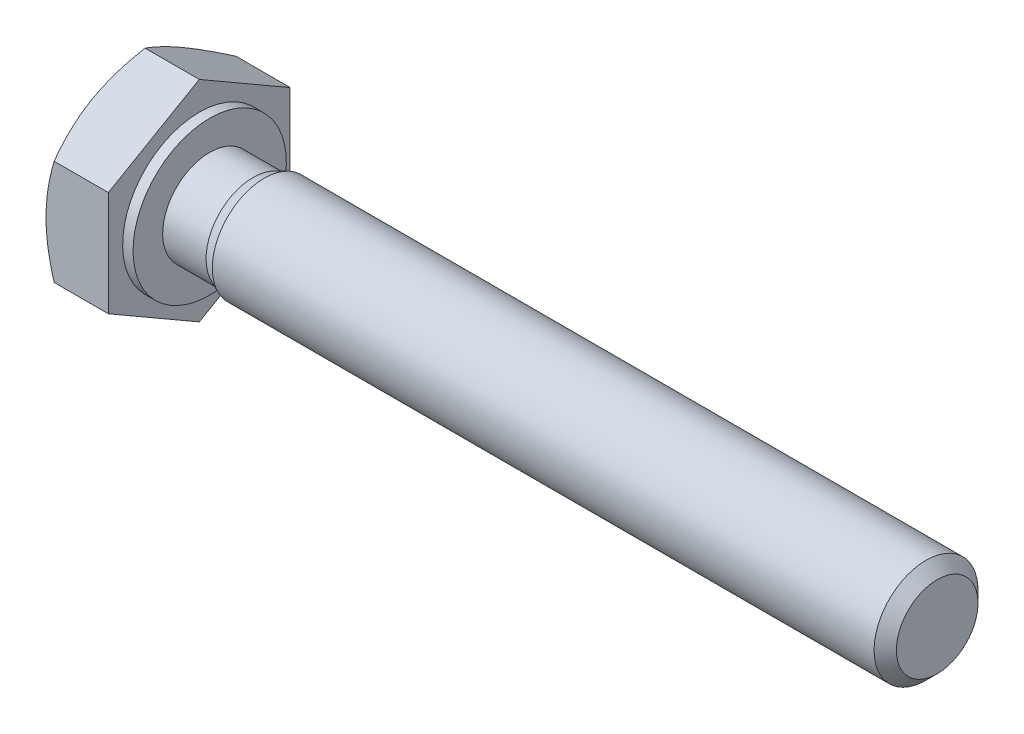
ISO-10303-21;
HEADER;
FILE_DESCRIPTION(('STEP AP214'),'2;1');
FILE_NAME('part.step','',(''),(''),'','','');
FILE_SCHEMA(('AUTOMOTIVE_DESIGN { 1 0 10303 214 1 1 1 1 }'));
ENDSEC;
DATA;
#1=APPLICATION_CONTEXT('core data for automotive mechanical design processes');
#2=APPLICATION_PROTOCOL_DEFINITION('international standard','automotive_design',2000,#1);
#3=PRODUCT_CONTEXT('',#1,'mechanical');
#4=PRODUCT('Part','Part','',(#3));
#5=PRODUCT_RELATED_PRODUCT_CATEGORY('part','',(#4));
#6=PRODUCT_DEFINITION_FORMATION('','',#4);
#7=PRODUCT_DEFINITION_CONTEXT('part definition',#1,'design');
#8=PRODUCT_DEFINITION('design','',#6,#7);
#9=PRODUCT_DEFINITION_SHAPE('','',#8);
#10=(LENGTH_UNIT() NAMED_UNIT(*) SI_UNIT(.MILLI.,.METRE.));
#11=(NAMED_UNIT(*) PLANE_ANGLE_UNIT() SI_UNIT($,.RADIAN.));
#12=(NAMED_UNIT(*) SI_UNIT($,.STERADIAN.) SOLID_ANGLE_UNIT());
#13=UNCERTAINTY_MEASURE_WITH_UNIT(LENGTH_MEASURE(1.E-05),#10,'distance_accuracy_value','');
#14=(GEOMETRIC_REPRESENTATION_CONTEXT(3) GLOBAL_UNCERTAINTY_ASSIGNED_CONTEXT((#13)) GLOBAL_UNIT_ASSIGNED_CONTEXT((#10,
#11,#12)) REPRESENTATION_CONTEXT('',''));
#15=CARTESIAN_POINT('',(0.,0.,0.));
#16=DIRECTION('',(0.,0.,1.));
#17=DIRECTION('',(1.,0.,0.));
#18=AXIS2_PLACEMENT_3D('',#15,#16,#17);
#19=CARTESIAN_POINT('',(-2.80009999999999,0.,0.));
#20=DIRECTION('',(1.,0.,0.));
#21=DIRECTION('',(0.,1.,0.));
#22=AXIS2_PLACEMENT_3D('',#19,#20,#21);
#23=PLANE('',#22);
#24=CARTESIAN_POINT('',(-2.80010000001698,0.,0.));
#25=DIRECTION('',(1.,0.,0.));
#26=DIRECTION('',(0.,0.,-1.));
#27=AXIS2_PLACEMENT_3D('',#24,#25,#26);
#28=CIRCLE('',#27,3.49999999997408);
#29=CARTESIAN_POINT('',(-2.8001000000095,3.03108891323431,-1.74999999999352));
#30=VERTEX_POINT('',#29);
#31=CARTESIAN_POINT('',(-2.8001000000095,3.03108891323431,1.74999999999352));
#32=VERTEX_POINT('',#31);
#33=EDGE_CURVE('E372',#30,#32,#28,.T.);
#34=ORIENTED_EDGE('',*,*,#33,.F.);
#35=CARTESIAN_POINT('',(-2.80010000001698,0.,0.));
#36=DIRECTION('',(1.,0.,0.));
#37=DIRECTION('',(0.,0.,-1.));
#38=AXIS2_PLACEMENT_3D('',#35,#36,#37);
#39=CIRCLE('',#38,3.49999999997408);
#40=CARTESIAN_POINT('',(-2.8001000000095,0.,-3.49999999998704));
#41=VERTEX_POINT('',#40);
#42=EDGE_CURVE('E368',#41,#30,#39,.T.);
#43=ORIENTED_EDGE('',*,*,#42,.F.);
#44=CARTESIAN_POINT('',(-2.80010000001698,0.,0.));
#45=DIRECTION('',(1.,0.,0.));
#46=DIRECTION('',(0.,0.,-1.));
#47=AXIS2_PLACEMENT_3D('',#44,#45,#46);
#48=CIRCLE('',#47,3.49999999997408);
#49=CARTESIAN_POINT('',(-2.8001000000095,-3.03108891323431,-1.74999999999352));
#50=VERTEX_POINT('',#49);
#51=EDGE_CURVE('E364',#50,#41,#48,.T.);
#52=ORIENTED_EDGE('',*,*,#51,.F.);
#53=CARTESIAN_POINT('',(-2.80010000001698,0.,0.));
#54=DIRECTION('',(1.,0.,0.));
#55=DIRECTION('',(0.,0.,-1.));
#56=AXIS2_PLACEMENT_3D('',#53,#54,#55);
#57=CIRCLE('',#56,3.49999999997408);
#58=CARTESIAN_POINT('',(-2.8001000000095,-3.03108891323431,1.74999999999352));
#59=VERTEX_POINT('',#58);
#60=EDGE_CURVE('E91',#59,#50,#57,.T.);
#61=ORIENTED_EDGE('',*,*,#60,.F.);
#62=CARTESIAN_POINT('',(-2.80010000001698,0.,0.));
#63=DIRECTION('',(1.,0.,0.));
#64=DIRECTION('',(0.,0.,-1.));
#65=AXIS2_PLACEMENT_3D('',#62,#63,#64);
#66=CIRCLE('',#65,3.49999999997408);
#67=CARTESIAN_POINT('',(-2.8001000000095,0.,3.49999999998704));
#68=VERTEX_POINT('',#67);
#69=EDGE_CURVE('E88',#68,#59,#66,.T.);
#70=ORIENTED_EDGE('',*,*,#69,.F.);
#71=CARTESIAN_POINT('',(-2.80010000001698,0.,0.));
#72=DIRECTION('',(1.,0.,0.));
#73=DIRECTION('',(0.,0.,-1.));
#74=AXIS2_PLACEMENT_3D('',#71,#72,#73);
#75=CIRCLE('',#74,3.49999999997408);
#76=EDGE_CURVE('E20',#32,#68,#75,.T.);
#77=ORIENTED_EDGE('',*,*,#76,.F.);
#78=EDGE_LOOP('',(#34,#43,#52,#61,#70,#77));
#79=FACE_BOUND('',#78,.T.);
#80=ADVANCED_FACE('F17',(#79),#23,.F.);
#81=CARTESIAN_POINT('',(-2.48561696463412,0.,0.));
#82=DIRECTION('',(1.,0.,0.));
#83=DIRECTION('',(0.,0.,-1.));
#84=AXIS2_PLACEMENT_3D('',#81,#82,#83);
#85=CONICAL_SURFACE('',#84,4.04470059538653,1.04719755120523);
#86=ORIENTED_EDGE('',*,*,#76,.T.);
#87=CARTESIAN_POINT('',(-2.48749260883797,2.02072594216586,3.5));
#88=CARTESIAN_POINT('',(-2.53498760588299,1.85623971145421,3.5));
#89=CARTESIAN_POINT('',(-2.57850131522338,1.69043621589809,3.5));
#90=CARTESIAN_POINT('',(-2.65523695818825,1.35736768336483,3.5));
#91=CARTESIAN_POINT('',(-2.68850978240536,1.19011426411847,3.5));
#92=CARTESIAN_POINT('',(-2.72936316154827,0.937655668885754,3.5));
#93=CARTESIAN_POINT('',(-2.74147660437875,0.853183894577956,3.5));
#94=CARTESIAN_POINT('',(-2.7624452264286,0.683835945146513,3.5));
#95=CARTESIAN_POINT('',(-2.77130049140569,0.598959780726294,3.5));
#96=CARTESIAN_POINT('',(-2.78559717089421,0.428489104641917,3.5));
#97=CARTESIAN_POINT('',(-2.7910212245218,0.342893125795462,3.5));
#98=CARTESIAN_POINT('',(-2.79828014667388,0.171532828534741,3.5));
#99=CARTESIAN_POINT('',(-2.80011430437159,0.0857684801466129,3.5));
#100=CARTESIAN_POINT('',(-2.80010000000202,0.,3.5));
#101=B_SPLINE_CURVE_WITH_KNOTS('',3,(#87,#88,#89,#90,#91,#92,#93,#94,#95,#96,#97,#98,#99,#100),
.UNSPECIFIED.,.F.,.F.,(4,2,2,2,2,2,4),(0.,0.513825660873702,1.02505510269113,1.28100524354765,
1.53694864711989,1.79417690106573,2.05145608301609),.UNSPECIFIED.);
#102=CARTESIAN_POINT('',(-2.48749260883797,2.02072594216422,3.50000000000095));
#103=VERTEX_POINT('',#102);
#104=EDGE_CURVE('E109',#103,#68,#101,.T.);
#105=ORIENTED_EDGE('',*,*,#104,.F.);
#106=CARTESIAN_POINT('',(-2.80010000000202,3.03108891324553,1.75));
#107=CARTESIAN_POINT('',(-2.80011430437159,2.98820467317223,1.82427768265095));
#108=CARTESIAN_POINT('',(-2.79828014667388,2.94532249897816,1.89855178709409));
#109=CARTESIAN_POINT('',(-2.7910212245218,2.8596423503478,2.04695415772193));
#110=CARTESIAN_POINT('',(-2.78559717089421,2.81684436092457,2.12108244986476));
#111=CARTESIAN_POINT('',(-2.77130049140569,2.73160902288238,2.26871438595414));
#112=CARTESIAN_POINT('',(-2.7624452264286,2.68917094067227,2.34221930051783));
#113=CARTESIAN_POINT('',(-2.74147660437875,2.60449696595655,2.48887892680427));
#114=CARTESIAN_POINT('',(-2.72936316154827,2.56226107880265,2.56203362925757));
#115=CARTESIAN_POINT('',(-2.68850978240536,2.43603178118629,2.78066918613283));
#116=CARTESIAN_POINT('',(-2.65523695818825,2.3524050715631,2.92551489607));
#117=CARTESIAN_POINT('',(-2.57850131522337,2.18587080529647,3.213960706445));
#118=CARTESIAN_POINT('',(-2.53498760588299,2.10296905751841,3.35755074563286));
#119=CARTESIAN_POINT('',(-2.48749260883797,2.02072594216258,3.50000000000191));
#120=B_SPLINE_CURVE_WITH_KNOTS('',3,(#106,#107,#108,#109,#110,#111,#112,#113,#114,#115,#116,
#117,#118,#119),.UNSPECIFIED.,.F.,.F.,(4,2,2,2,2,2,4),(0.,0.257279181950367,0.514507435896208,
0.770450839468459,1.02640098032498,1.53763042214241,2.05145608301612),.UNSPECIFIED.);
#121=EDGE_CURVE('E103',#32,#103,#120,.T.);
#122=ORIENTED_EDGE('',*,*,#121,.F.);
#123=EDGE_LOOP('',(#86,#105,#122));
#124=FACE_BOUND('',#123,.T.);
#125=ADVANCED_FACE('F108',(#124),#85,.T.);
#126=CARTESIAN_POINT('',(-2.48561696463412,0.,0.));
#127=DIRECTION('',(1.,0.,0.));
#128=DIRECTION('',(0.,0.,-1.));
#129=AXIS2_PLACEMENT_3D('',#126,#127,#128);
#130=CONICAL_SURFACE('',#129,4.04470059538653,1.04719755120523);
#131=CARTESIAN_POINT('',(-2.80010000000202,0.,3.5));
#132=CARTESIAN_POINT('',(-2.80011430437159,-0.085768480146616,3.5));
#133=CARTESIAN_POINT('',(-2.79828014667387,-0.171532828534744,3.5));
#134=CARTESIAN_POINT('',(-2.7910212245218,-0.342893125795465,3.5));
#135=CARTESIAN_POINT('',(-2.78559717089421,-0.42848910464192,3.5));
#136=CARTESIAN_POINT('',(-2.77130049140569,-0.598959780726298,3.5));
#137=CARTESIAN_POINT('',(-2.7624452264286,-0.683835945146517,3.5));
#138=CARTESIAN_POINT('',(-2.74147660437875,-0.85318389457796,3.5));
#139=CARTESIAN_POINT('',(-2.72936316154827,-0.937655668885758,3.5));
#140=CARTESIAN_POINT('',(-2.68850978240536,-1.19011426411847,3.5));
#141=CARTESIAN_POINT('',(-2.65523695818825,-1.35736768336484,3.5));
#142=CARTESIAN_POINT('',(-2.57850131522338,-1.69043621589809,3.5));
#143=CARTESIAN_POINT('',(-2.53498760588299,-1.85623971145421,3.5));
#144=CARTESIAN_POINT('',(-2.48749260883797,-2.02072594216587,3.5));
#145=B_SPLINE_CURVE_WITH_KNOTS('',3,(#131,#132,#133,#134,#135,#136,#137,#138,#139,#140,#141,
#142,#143,#144),.UNSPECIFIED.,.F.,.F.,(4,2,2,2,2,2,4),(0.,0.257279181950363,0.5145074358962,
0.770450839468448,1.02640098032496,1.53763042214239,2.0514560830161),.UNSPECIFIED.);
#146=CARTESIAN_POINT('',(-2.48749260883797,-2.02072594216423,3.50000000000095));
#147=VERTEX_POINT('',#146);
#148=EDGE_CURVE('E96',#68,#147,#145,.T.);
#149=ORIENTED_EDGE('',*,*,#148,.F.);
#150=ORIENTED_EDGE('',*,*,#69,.T.);
#151=CARTESIAN_POINT('',(-2.48749260883796,-2.02072594216259,3.50000000000191));
#152=CARTESIAN_POINT('',(-2.53498760588298,-2.10296905751842,3.35755074563287));
#153=CARTESIAN_POINT('',(-2.57850131522337,-2.18587080529648,3.21396070644501));
#154=CARTESIAN_POINT('',(-2.65523695818825,-2.35240507156311,2.92551489607));
#155=CARTESIAN_POINT('',(-2.68850978240535,-2.43603178118629,2.78066918613284));
#156=CARTESIAN_POINT('',(-2.72936316154827,-2.56226107880265,2.56203362925757));
#157=CARTESIAN_POINT('',(-2.74147660437875,-2.60449696595655,2.48887892680427));
#158=CARTESIAN_POINT('',(-2.7624452264286,-2.68917094067227,2.34221930051784));
#159=CARTESIAN_POINT('',(-2.77130049140569,-2.73160902288238,2.26871438595414));
#160=CARTESIAN_POINT('',(-2.78559717089421,-2.81684436092457,2.12108244986476));
#161=CARTESIAN_POINT('',(-2.7910212245218,-2.8596423503478,2.04695415772193));
#162=CARTESIAN_POINT('',(-2.79828014667387,-2.94532249897816,1.89855178709409));
#163=CARTESIAN_POINT('',(-2.80011430437159,-2.98820467317223,1.82427768265095));
#164=CARTESIAN_POINT('',(-2.80010000000201,-3.03108891324553,1.75));
#165=B_SPLINE_CURVE_WITH_KNOTS('',3,(#151,#152,#153,#154,#155,#156,#157,#158,#159,#160,#161,
#162,#163,#164),.UNSPECIFIED.,.F.,.F.,(4,2,2,2,2,2,4),(0.,0.513825660873709,1.02505510269114,
1.28100524354766,1.53694864711991,1.79417690106576,2.05145608301612),.UNSPECIFIED.);
#166=EDGE_CURVE('E98',#147,#59,#165,.T.);
#167=ORIENTED_EDGE('',*,*,#166,.F.);
#168=EDGE_LOOP('',(#149,#150,#167));
#169=FACE_BOUND('',#168,.T.);
#170=ADVANCED_FACE('F97',(#169),#130,.T.);
#171=CARTESIAN_POINT('',(-2.48561696463412,0.,0.));
#172=DIRECTION('',(1.,0.,0.));
#173=DIRECTION('',(0.,0.,-1.));
#174=AXIS2_PLACEMENT_3D('',#171,#172,#173);
#175=CONICAL_SURFACE('',#174,4.04470059538653,1.04719755120523);
#176=CARTESIAN_POINT('',(-2.80010000000201,-3.03108891324553,1.75));
#177=CARTESIAN_POINT('',(-2.80011430437159,-3.07397315331884,1.67572231734905));
#178=CARTESIAN_POINT('',(-2.79828014667387,-3.11685532751291,1.60144821290592));
#179=CARTESIAN_POINT('',(-2.7910212245218,-3.20253547614327,1.45304584227808));
#180=CARTESIAN_POINT('',(-2.78559717089421,-3.24533346556649,1.37891755013525));
#181=CARTESIAN_POINT('',(-2.77130049140569,-3.33056880360868,1.23128561404587));
#182=CARTESIAN_POINT('',(-2.7624452264286,-3.37300688581879,1.15778069948218));
#183=CARTESIAN_POINT('',(-2.74147660437875,-3.45768086053451,1.01112107319574));
#184=CARTESIAN_POINT('',(-2.72936316154827,-3.49991674768841,0.937966370742446));
#185=CARTESIAN_POINT('',(-2.68850978240536,-3.62614604530477,0.719330813867181));
#186=CARTESIAN_POINT('',(-2.65523695818825,-3.70977275492795,0.574485103930018));
#187=CARTESIAN_POINT('',(-2.57850131522338,-3.87630702119458,0.286039293555015));
#188=CARTESIAN_POINT('',(-2.53498760588299,-3.95920876897264,0.142449254367156));
#189=CARTESIAN_POINT('',(-2.48749260883797,-4.04145188432847,-1.88510767100038E-12));
#190=B_SPLINE_CURVE_WITH_KNOTS('',3,(#176,#177,#178,#179,#180,#181,#182,#183,#184,#185,#186,
#187,#188,#189),.UNSPECIFIED.,.F.,.F.,(4,2,2,2,2,2,4),(0.,0.257279181950364,0.514507435896202,
0.77045083946845,1.02640098032497,1.5376304221424,2.0514560830161),.UNSPECIFIED.);
#191=CARTESIAN_POINT('',(-2.48749260883797,-4.04145188432847,0.));
#192=VERTEX_POINT('',#191);
#193=EDGE_CURVE('E114',#59,#192,#190,.T.);
#194=ORIENTED_EDGE('',*,*,#193,.F.);
#195=ORIENTED_EDGE('',*,*,#60,.T.);
#196=CARTESIAN_POINT('',(-2.48749260883796,-4.04145188432848,1.90549218164857E-12));
#197=CARTESIAN_POINT('',(-2.53498760588298,-3.95920876897265,-0.142449254367138));
#198=CARTESIAN_POINT('',(-2.57850131522337,-3.87630702119459,-0.286039293554998));
#199=CARTESIAN_POINT('',(-2.65523695818825,-3.70977275492796,-0.574485103930004));
#200=CARTESIAN_POINT('',(-2.68850978240535,-3.62614604530478,-0.719330813867169));
#201=CARTESIAN_POINT('',(-2.72936316154827,-3.49991674768842,-0.937966370742436));
#202=CARTESIAN_POINT('',(-2.74147660437875,-3.45768086053452,-1.01112107319574));
#203=CARTESIAN_POINT('',(-2.7624452264286,-3.3730068858188,-1.15778069948217));
#204=CARTESIAN_POINT('',(-2.77130049140569,-3.33056880360869,-1.23128561404587));
#205=CARTESIAN_POINT('',(-2.78559717089421,-3.2453334655665,-1.37891755013525));
#206=CARTESIAN_POINT('',(-2.7910212245218,-3.20253547614327,-1.45304584227807));
#207=CARTESIAN_POINT('',(-2.79828014667387,-3.11685532751291,-1.60144821290591));
#208=CARTESIAN_POINT('',(-2.80011430437159,-3.07397315331884,-1.67572231734905));
#209=CARTESIAN_POINT('',(-2.80010000000201,-3.03108891324553,-1.75));
#210=B_SPLINE_CURVE_WITH_KNOTS('',3,(#196,#197,#198,#199,#200,#201,#202,#203,#204,#205,#206,
#207,#208,#209),.UNSPECIFIED.,.F.,.F.,(4,2,2,2,2,2,4),(0.,0.51382566087371,1.02505510269115,
1.28100524354767,1.53694864711992,1.79417690106576,2.05145608301613),.UNSPECIFIED.);
#211=EDGE_CURVE('E208',#192,#50,#210,.T.);
#212=ORIENTED_EDGE('',*,*,#211,.F.);
#213=EDGE_LOOP('',(#194,#195,#212));
#214=FACE_BOUND('',#213,.T.);
#215=ADVANCED_FACE('F216',(#214),#175,.T.);
#216=CARTESIAN_POINT('',(-2.48561696463412,0.,0.));
#217=DIRECTION('',(1.,0.,0.));
#218=DIRECTION('',(0.,0.,-1.));
#219=AXIS2_PLACEMENT_3D('',#216,#217,#218);
#220=CONICAL_SURFACE('',#219,4.04470059538653,1.04719755120523);
#221=CARTESIAN_POINT('',(-2.80010000000201,-3.03108891324553,-1.75));
#222=CARTESIAN_POINT('',(-2.80011430437159,-2.98820467317223,-1.82427768265095));
#223=CARTESIAN_POINT('',(-2.79828014667387,-2.94532249897816,-1.89855178709409));
#224=CARTESIAN_POINT('',(-2.7910212245218,-2.8596423503478,-2.04695415772193));
#225=CARTESIAN_POINT('',(-2.78559717089421,-2.81684436092458,-2.12108244986475));
#226=CARTESIAN_POINT('',(-2.77130049140569,-2.73160902288239,-2.26871438595413));
#227=CARTESIAN_POINT('',(-2.7624452264286,-2.68917094067228,-2.34221930051783));
#228=CARTESIAN_POINT('',(-2.74147660437875,-2.60449696595655,-2.48887892680426));
#229=CARTESIAN_POINT('',(-2.72936316154827,-2.56226107880266,-2.56203362925756));
#230=CARTESIAN_POINT('',(-2.68850978240536,-2.4360317811863,-2.78066918613282));
#231=CARTESIAN_POINT('',(-2.65523695818825,-2.35240507156312,-2.92551489606998));
#232=CARTESIAN_POINT('',(-2.57850131522338,-2.18587080529649,-3.21396070644498));
#233=CARTESIAN_POINT('',(-2.53498760588299,-2.10296905751843,-3.35755074563284));
#234=CARTESIAN_POINT('',(-2.48749260883797,-2.0207259421626,-3.50000000000188));
#235=B_SPLINE_CURVE_WITH_KNOTS('',3,(#221,#222,#223,#224,#225,#226,#227,#228,#229,#230,#231,
#232,#233,#234),.UNSPECIFIED.,.F.,.F.,(4,2,2,2,2,2,4),(0.,0.257279181950364,0.5145074358962,
0.770450839468447,1.02640098032496,1.53763042214239,2.05145608301609),.UNSPECIFIED.);
#236=CARTESIAN_POINT('',(-2.48749260883797,-2.02072594216425,-3.50000000000094));
#237=VERTEX_POINT('',#236);
#238=EDGE_CURVE('E220',#50,#237,#235,.T.);
#239=ORIENTED_EDGE('',*,*,#238,.F.);
#240=ORIENTED_EDGE('',*,*,#51,.T.);
#241=CARTESIAN_POINT('',(-2.48749260883796,-2.02072594216589,-3.5));
#242=CARTESIAN_POINT('',(-2.53498760588298,-1.85623971145424,-3.5));
#243=CARTESIAN_POINT('',(-2.57850131522337,-1.69043621589812,-3.5));
#244=CARTESIAN_POINT('',(-2.65523695818825,-1.35736768336486,-3.5));
#245=CARTESIAN_POINT('',(-2.68850978240536,-1.19011426411849,-3.5));
#246=CARTESIAN_POINT('',(-2.72936316154827,-0.937655668885769,-3.5));
#247=CARTESIAN_POINT('',(-2.74147660437875,-0.853183894577971,-3.5));
#248=CARTESIAN_POINT('',(-2.7624452264286,-0.683835945146524,-3.5));
#249=CARTESIAN_POINT('',(-2.77130049140569,-0.598959780726304,-3.5));
#250=CARTESIAN_POINT('',(-2.78559717089421,-0.428489104641924,-3.5));
#251=CARTESIAN_POINT('',(-2.7910212245218,-0.342893125795468,-3.5));
#252=CARTESIAN_POINT('',(-2.79828014667387,-0.171532828534745,-3.5));
#253=CARTESIAN_POINT('',(-2.80011430437159,-0.085768480146615,-3.5));
#254=CARTESIAN_POINT('',(-2.80010000000201,0.,-3.5));
#255=B_SPLINE_CURVE_WITH_KNOTS('',3,(#241,#242,#243,#244,#245,#246,#247,#248,#249,#250,#251,
#252,#253,#254),.UNSPECIFIED.,.F.,.F.,(4,2,2,2,2,2,4),(0.,0.51382566087371,1.02505510269115,
1.28100524354767,1.53694864711992,1.79417690106576,2.05145608301613),.UNSPECIFIED.);
#256=EDGE_CURVE('E202',#237,#41,#255,.T.);
#257=ORIENTED_EDGE('',*,*,#256,.F.);
#258=EDGE_LOOP('',(#239,#240,#257));
#259=FACE_BOUND('',#258,.T.);
#260=ADVANCED_FACE('F213',(#259),#220,.T.);
#261=CARTESIAN_POINT('',(-2.48561696463412,0.,0.));
#262=DIRECTION('',(1.,0.,0.));
#263=DIRECTION('',(0.,0.,-1.));
#264=AXIS2_PLACEMENT_3D('',#261,#262,#263);
#265=CONICAL_SURFACE('',#264,4.04470059538653,1.04719755120523);
#266=ORIENTED_EDGE('',*,*,#42,.T.);
#267=CARTESIAN_POINT('',(-2.48749260883796,2.02072594216259,-3.50000000000191));
#268=CARTESIAN_POINT('',(-2.53498760588298,2.10296905751842,-3.35755074563287));
#269=CARTESIAN_POINT('',(-2.57850131522337,2.18587080529648,-3.21396070644501));
#270=CARTESIAN_POINT('',(-2.65523695818825,2.3524050715631,-2.92551489607));
#271=CARTESIAN_POINT('',(-2.68850978240535,2.43603178118629,-2.78066918613283));
#272=CARTESIAN_POINT('',(-2.72936316154827,2.56226107880265,-2.56203362925757));
#273=CARTESIAN_POINT('',(-2.74147660437875,2.60449696595655,-2.48887892680427));
#274=CARTESIAN_POINT('',(-2.7624452264286,2.68917094067227,-2.34221930051783));
#275=CARTESIAN_POINT('',(-2.77130049140569,2.73160902288238,-2.26871438595414));
#276=CARTESIAN_POINT('',(-2.78559717089421,2.81684436092457,-2.12108244986476));
#277=CARTESIAN_POINT('',(-2.7910212245218,2.8596423503478,-2.04695415772193));
#278=CARTESIAN_POINT('',(-2.79828014667387,2.94532249897816,-1.89855178709409));
#279=CARTESIAN_POINT('',(-2.80011430437159,2.98820467317222,-1.82427768265095));
#280=CARTESIAN_POINT('',(-2.80010000000202,3.03108891324553,-1.75));
#281=B_SPLINE_CURVE_WITH_KNOTS('',3,(#267,#268,#269,#270,#271,#272,#273,#274,#275,#276,#277,
#278,#279,#280),.UNSPECIFIED.,.F.,.F.,(4,2,2,2,2,2,4),(0.,0.513825660873709,1.02505510269114,
1.28100524354766,1.53694864711992,1.79417690106576,2.05145608301612),.UNSPECIFIED.);
#282=CARTESIAN_POINT('',(-2.48749260883797,2.02072594216423,-3.50000000000095));
#283=VERTEX_POINT('',#282);
#284=EDGE_CURVE('E174',#283,#30,#281,.T.);
#285=ORIENTED_EDGE('',*,*,#284,.F.);
#286=CARTESIAN_POINT('',(-2.80010000000201,0.,-3.5));
#287=CARTESIAN_POINT('',(-2.80011430437159,0.0857684801466146,-3.5));
#288=CARTESIAN_POINT('',(-2.79828014667387,0.171532828534743,-3.5));
#289=CARTESIAN_POINT('',(-2.7910212245218,0.342893125795464,-3.5));
#290=CARTESIAN_POINT('',(-2.78559717089421,0.428489104641919,-3.5));
#291=CARTESIAN_POINT('',(-2.77130049140569,0.598959780726297,-3.5));
#292=CARTESIAN_POINT('',(-2.7624452264286,0.683835945146516,-3.5));
#293=CARTESIAN_POINT('',(-2.74147660437875,0.85318389457796,-3.5));
#294=CARTESIAN_POINT('',(-2.72936316154827,0.937655668885757,-3.5));
#295=CARTESIAN_POINT('',(-2.68850978240536,1.19011426411847,-3.5));
#296=CARTESIAN_POINT('',(-2.65523695818825,1.35736768336484,-3.5));
#297=CARTESIAN_POINT('',(-2.57850131522338,1.69043621589809,-3.5));
#298=CARTESIAN_POINT('',(-2.53498760588299,1.85623971145421,-3.5));
#299=CARTESIAN_POINT('',(-2.48749260883797,2.02072594216587,-3.5));
#300=B_SPLINE_CURVE_WITH_KNOTS('',3,(#286,#287,#288,#289,#290,#291,#292,#293,#294,#295,#296,
#297,#298,#299),.UNSPECIFIED.,.F.,.F.,(4,2,2,2,2,2,4),(0.,0.257279181950364,0.514507435896201,
0.770450839468448,1.02640098032496,1.53763042214239,2.0514560830161),.UNSPECIFIED.);
#301=EDGE_CURVE('E197',#41,#283,#300,.T.);
#302=ORIENTED_EDGE('',*,*,#301,.F.);
#303=EDGE_LOOP('',(#266,#285,#302));
#304=FACE_BOUND('',#303,.T.);
#305=ADVANCED_FACE('F159',(#304),#265,.T.);
#306=CARTESIAN_POINT('',(-2.48561696463412,0.,0.));
#307=DIRECTION('',(1.,0.,0.));
#308=DIRECTION('',(0.,0.,-1.));
#309=AXIS2_PLACEMENT_3D('',#306,#307,#308);
#310=CONICAL_SURFACE('',#309,4.04470059538653,1.04719755120523);
#311=ORIENTED_EDGE('',*,*,#33,.T.);
#312=CARTESIAN_POINT('',(-2.48749260883797,4.04145188432848,-1.89469704332326E-12));
#313=CARTESIAN_POINT('',(-2.53498760588299,3.95920876897265,0.142449254367147));
#314=CARTESIAN_POINT('',(-2.57850131522337,3.87630702119459,0.286039293555007));
#315=CARTESIAN_POINT('',(-2.65523695818825,3.70977275492796,0.57448510393001));
#316=CARTESIAN_POINT('',(-2.68850978240536,3.62614604530477,0.719330813867175));
#317=CARTESIAN_POINT('',(-2.72936316154827,3.49991674768842,0.93796637074244));
#318=CARTESIAN_POINT('',(-2.74147660437875,3.45768086053452,1.01112107319574));
#319=CARTESIAN_POINT('',(-2.7624452264286,3.37300688581879,1.15778069948217));
#320=CARTESIAN_POINT('',(-2.77130049140569,3.33056880360868,1.23128561404587));
#321=CARTESIAN_POINT('',(-2.78559717089421,3.24533346556649,1.37891755013525));
#322=CARTESIAN_POINT('',(-2.7910212245218,3.20253547614327,1.45304584227807));
#323=CARTESIAN_POINT('',(-2.79828014667387,3.11685532751291,1.60144821290591));
#324=CARTESIAN_POINT('',(-2.80011430437159,3.07397315331884,1.67572231734905));
#325=CARTESIAN_POINT('',(-2.80010000000202,3.03108891324553,1.75));
#326=B_SPLINE_CURVE_WITH_KNOTS('',3,(#312,#313,#314,#315,#316,#317,#318,#319,#320,#321,#322,
#323,#324,#325),.UNSPECIFIED.,.F.,.F.,(4,2,2,2,2,2,4),(0.,0.513825660873707,1.02505510269114,
1.28100524354766,1.53694864711991,1.79417690106575,2.05145608301611),.UNSPECIFIED.);
#327=CARTESIAN_POINT('',(-2.48749260883829,4.04145188432793,-9.51148669664066E-13));
#328=VERTEX_POINT('',#327);
#329=EDGE_CURVE('E144',#328,#32,#326,.T.);
#330=ORIENTED_EDGE('',*,*,#329,.F.);
#331=CARTESIAN_POINT('',(-2.80010000000201,3.03108891324553,-1.75));
#332=CARTESIAN_POINT('',(-2.80011430437159,3.07397315331884,-1.67572231734905));
#333=CARTESIAN_POINT('',(-2.79828014667388,3.11685532751291,-1.60144821290591));
#334=CARTESIAN_POINT('',(-2.7910212245218,3.20253547614327,-1.45304584227807));
#335=CARTESIAN_POINT('',(-2.78559717089421,3.24533346556649,-1.37891755013525));
#336=CARTESIAN_POINT('',(-2.77130049140569,3.33056880360868,-1.23128561404587));
#337=CARTESIAN_POINT('',(-2.7624452264286,3.37300688581879,-1.15778069948217));
#338=CARTESIAN_POINT('',(-2.74147660437875,3.45768086053452,-1.01112107319574));
#339=CARTESIAN_POINT('',(-2.72936316154827,3.49991674768841,-0.937966370742441));
#340=CARTESIAN_POINT('',(-2.68850978240536,3.62614604530477,-0.719330813867175));
#341=CARTESIAN_POINT('',(-2.65523695818825,3.70977275492796,-0.574485103930011));
#342=CARTESIAN_POINT('',(-2.57850131522337,3.87630702119459,-0.286039293555007));
#343=CARTESIAN_POINT('',(-2.53498760588299,3.95920876897264,-0.142449254367147));
#344=CARTESIAN_POINT('',(-2.48749260883797,4.04145188432847,1.89478551940359E-12));
#345=B_SPLINE_CURVE_WITH_KNOTS('',3,(#331,#332,#333,#334,#335,#336,#337,#338,#339,#340,#341,
#342,#343,#344),.UNSPECIFIED.,.F.,.F.,(4,2,2,2,2,2,4),(0.,0.257279181950366,0.514507435896205,
0.770450839468454,1.02640098032497,1.53763042214241,2.05145608301611),.UNSPECIFIED.);
#346=EDGE_CURVE('E165',#30,#328,#345,.T.);
#347=ORIENTED_EDGE('',*,*,#346,.F.);
#348=EDGE_LOOP('',(#311,#330,#347));
#349=FACE_BOUND('',#348,.T.);
#350=ADVANCED_FACE('F153',(#349),#310,.T.);
#351=CARTESIAN_POINT('',(-0.400099999999994,4.04145188432738,0.));
#352=DIRECTION('',(0.,0.866025403784438,0.500000000000001));
#353=DIRECTION('',(0.,-0.500000000000001,0.866025403784438));
#354=AXIS2_PLACEMENT_3D('',#351,#352,#353);
#355=PLANE('',#354);
#356=DIRECTION('',(0.,-0.5,0.866025403784438));
#357=VECTOR('',#356,1.);
#358=CARTESIAN_POINT('',(-0.400099999999994,4.04145188432738,0.));
#359=LINE('',#358,#357);
#360=CARTESIAN_POINT('',(-0.400099999999994,4.04145188432738,0.));
#361=VERTEX_POINT('',#360);
#362=CARTESIAN_POINT('',(-0.400099999999993,2.02072594216369,3.5));
#363=VERTEX_POINT('',#362);
#364=EDGE_CURVE('E296',#361,#363,#359,.T.);
#365=ORIENTED_EDGE('',*,*,#364,.F.);
#366=DIRECTION('',(1.,0.,0.));
#367=VECTOR('',#366,1.);
#368=CARTESIAN_POINT('',(-0.400099999999994,4.04145188432738,0.));
#369=LINE('',#368,#367);
#370=EDGE_CURVE('E173',#328,#361,#369,.T.);
#371=ORIENTED_EDGE('',*,*,#370,.F.);
#372=ORIENTED_EDGE('',*,*,#329,.T.);
#373=ORIENTED_EDGE('',*,*,#121,.T.);
#374=DIRECTION('',(1.,0.,0.));
#375=VECTOR('',#374,1.);
#376=CARTESIAN_POINT('',(-0.400099999999994,2.02072594216369,3.5));
#377=LINE('',#376,#375);
#378=EDGE_CURVE('E102',#363,#103,#377,.F.);
#379=ORIENTED_EDGE('',*,*,#378,.F.);
#380=EDGE_LOOP('',(#365,#371,#372,#373,#379));
#381=FACE_BOUND('',#380,.T.);
#382=ADVANCED_FACE('F150',(#381),#355,.T.);
#383=CARTESIAN_POINT('',(-0.400099999999994,2.02072594216369,3.5));
#384=DIRECTION('',(0.,0.,1.));
#385=DIRECTION('',(0.,-1.,0.));
#386=AXIS2_PLACEMENT_3D('',#383,#384,#385);
#387=PLANE('',#386);
#388=ORIENTED_EDGE('',*,*,#378,.T.);
#389=ORIENTED_EDGE('',*,*,#104,.T.);
#390=ORIENTED_EDGE('',*,*,#148,.T.);
#391=DIRECTION('',(1.,0.,0.));
#392=VECTOR('',#391,1.);
#393=CARTESIAN_POINT('',(-0.400099999999993,-2.02072594216369,3.5));
#394=LINE('',#393,#392);
#395=CARTESIAN_POINT('',(-0.400099999999993,-2.02072594216369,3.5));
#396=VERTEX_POINT('',#395);
#397=EDGE_CURVE('E116',#396,#147,#394,.F.);
#398=ORIENTED_EDGE('',*,*,#397,.F.);
#399=DIRECTION('',(0.,1.,0.));
#400=VECTOR('',#399,1.);
#401=CARTESIAN_POINT('',(-0.400099999999993,0.,3.5));
#402=LINE('',#401,#400);
#403=EDGE_CURVE('E292',#363,#396,#402,.F.);
#404=ORIENTED_EDGE('',*,*,#403,.F.);
#405=EDGE_LOOP('',(#388,#389,#390,#398,#404));
#406=FACE_BOUND('',#405,.T.);
#407=ADVANCED_FACE('F112',(#406),#387,.T.);
#408=CARTESIAN_POINT('',(-0.400099999999993,-2.02072594216369,3.5));
#409=DIRECTION('',(0.,-0.866025403784439,0.5));
#410=DIRECTION('',(0.,-0.5,-0.866025403784439));
#411=AXIS2_PLACEMENT_3D('',#408,#409,#410);
#412=PLANE('',#411);
#413=ORIENTED_EDGE('',*,*,#397,.T.);
#414=ORIENTED_EDGE('',*,*,#166,.T.);
#415=ORIENTED_EDGE('',*,*,#193,.T.);
#416=DIRECTION('',(1.,0.,0.));
#417=VECTOR('',#416,1.);
#418=CARTESIAN_POINT('',(-0.400099999999993,-4.04145188432738,0.));
#419=LINE('',#418,#417);
#420=CARTESIAN_POINT('',(-0.400099999999993,-4.04145188432738,0.));
#421=VERTEX_POINT('',#420);
#422=EDGE_CURVE('E225',#421,#192,#419,.F.);
#423=ORIENTED_EDGE('',*,*,#422,.F.);
#424=DIRECTION('',(0.,-0.5,-0.866025403784439));
#425=VECTOR('',#424,1.);
#426=CARTESIAN_POINT('',(-0.400099999999993,-2.02072594216369,3.5));
#427=LINE('',#426,#425);
#428=EDGE_CURVE('E295',#396,#421,#427,.T.);
#429=ORIENTED_EDGE('',*,*,#428,.F.);
#430=EDGE_LOOP('',(#413,#414,#415,#423,#429));
#431=FACE_BOUND('',#430,.T.);
#432=ADVANCED_FACE('F229',(#431),#412,.T.);
#433=CARTESIAN_POINT('',(-0.400099999999993,-4.04145188432738,0.));
#434=DIRECTION('',(0.,-0.866025403784438,-0.5));
#435=DIRECTION('',(0.,0.5,-0.866025403784438));
#436=AXIS2_PLACEMENT_3D('',#433,#434,#435);
#437=PLANE('',#436);
#438=ORIENTED_EDGE('',*,*,#422,.T.);
#439=ORIENTED_EDGE('',*,*,#211,.T.);
#440=ORIENTED_EDGE('',*,*,#238,.T.);
#441=DIRECTION('',(1.,0.,0.));
#442=VECTOR('',#441,1.);
#443=CARTESIAN_POINT('',(-0.400099999999993,-2.02072594216369,-3.5));
#444=LINE('',#443,#442);
#445=CARTESIAN_POINT('',(-0.400099999999993,-2.02072594216369,-3.5));
#446=VERTEX_POINT('',#445);
#447=EDGE_CURVE('E330',#446,#237,#444,.F.);
#448=ORIENTED_EDGE('',*,*,#447,.F.);
#449=DIRECTION('',(0.,0.5,-0.866025403784438));
#450=VECTOR('',#449,1.);
#451=CARTESIAN_POINT('',(-0.400099999999992,-4.04145188432738,0.));
#452=LINE('',#451,#450);
#453=EDGE_CURVE('E301',#421,#446,#452,.T.);
#454=ORIENTED_EDGE('',*,*,#453,.F.);
#455=EDGE_LOOP('',(#438,#439,#440,#448,#454));
#456=FACE_BOUND('',#455,.T.);
#457=ADVANCED_FACE('F194',(#456),#437,.T.);
#458=CARTESIAN_POINT('',(-0.400099999999993,-2.02072594216369,-3.5));
#459=DIRECTION('',(0.,0.,-1.));
#460=DIRECTION('',(0.,1.,0.));
#461=AXIS2_PLACEMENT_3D('',#458,#459,#460);
#462=PLANE('',#461);
#463=DIRECTION('',(0.,1.,0.));
#464=VECTOR('',#463,1.);
#465=CARTESIAN_POINT('',(-0.400099999999993,0.,-3.5));
#466=LINE('',#465,#464);
#467=CARTESIAN_POINT('',(-0.400099999999994,2.02072594216369,-3.5));
#468=VERTEX_POINT('',#467);
#469=EDGE_CURVE('E306',#446,#468,#466,.T.);
#470=ORIENTED_EDGE('',*,*,#469,.F.);
#471=ORIENTED_EDGE('',*,*,#447,.T.);
#472=ORIENTED_EDGE('',*,*,#256,.T.);
#473=ORIENTED_EDGE('',*,*,#301,.T.);
#474=DIRECTION('',(1.,0.,0.));
#475=VECTOR('',#474,1.);
#476=CARTESIAN_POINT('',(-0.400099999999994,2.02072594216369,-3.5));
#477=LINE('',#476,#475);
#478=EDGE_CURVE('E35',#468,#283,#477,.F.);
#479=ORIENTED_EDGE('',*,*,#478,.F.);
#480=EDGE_LOOP('',(#470,#471,#472,#473,#479));
#481=FACE_BOUND('',#480,.T.);
#482=ADVANCED_FACE('F187',(#481),#462,.T.);
#483=CARTESIAN_POINT('',(-0.400099999999994,2.02072594216369,-3.5));
#484=DIRECTION('',(0.,0.866025403784439,-0.5));
#485=DIRECTION('',(0.,0.5,0.866025403784439));
#486=AXIS2_PLACEMENT_3D('',#483,#484,#485);
#487=PLANE('',#486);
#488=DIRECTION('',(0.,0.5,0.866025403784439));
#489=VECTOR('',#488,1.);
#490=CARTESIAN_POINT('',(-0.400099999999993,2.02072594216369,-3.5));
#491=LINE('',#490,#489);
#492=EDGE_CURVE('E285',#468,#361,#491,.T.);
#493=ORIENTED_EDGE('',*,*,#492,.F.);
#494=ORIENTED_EDGE('',*,*,#478,.T.);
#495=ORIENTED_EDGE('',*,*,#284,.T.);
#496=ORIENTED_EDGE('',*,*,#346,.T.);
#497=ORIENTED_EDGE('',*,*,#370,.T.);
#498=EDGE_LOOP('',(#493,#494,#495,#496,#497));
#499=FACE_BOUND('',#498,.T.);
#500=ADVANCED_FACE('F181',(#499),#487,.T.);
#501=CARTESIAN_POINT('',(-0.400099999999993,0.,0.));
#502=DIRECTION('',(1.,0.,0.));
#503=DIRECTION('',(0.,1.,0.));
#504=AXIS2_PLACEMENT_3D('',#501,#502,#503);
#505=PLANE('',#504);
#506=CARTESIAN_POINT('',(-0.400099999999994,0.,0.));
#507=DIRECTION('',(1.,0.,0.));
#508=DIRECTION('',(0.,1.,0.));
#509=AXIS2_PLACEMENT_3D('',#506,#507,#508);
#510=CIRCLE('',#509,2.95);
#511=CARTESIAN_POINT('',(-0.400099999999994,2.95,0.));
#512=VERTEX_POINT('',#511);
#513=EDGE_CURVE('E175',#512,#512,#510,.T.);
#514=ORIENTED_EDGE('',*,*,#513,.F.);
#515=EDGE_LOOP('',(#514));
#516=FACE_BOUND('',#515,.T.);
#517=ORIENTED_EDGE('',*,*,#469,.T.);
#518=ORIENTED_EDGE('',*,*,#492,.T.);
#519=ORIENTED_EDGE('',*,*,#364,.T.);
#520=ORIENTED_EDGE('',*,*,#403,.T.);
#521=ORIENTED_EDGE('',*,*,#428,.T.);
#522=ORIENTED_EDGE('',*,*,#453,.T.);
#523=EDGE_LOOP('',(#517,#518,#519,#520,#521,#522));
#524=FACE_BOUND('',#523,.T.);
#525=ADVANCED_FACE('F186',(#516,#524),#505,.T.);
#526=CARTESIAN_POINT('',(-0.200049999999994,0.,0.));
#527=DIRECTION('',(1.,0.,0.));
#528=DIRECTION('',(0.,1.,0.));
#529=AXIS2_PLACEMENT_3D('',#526,#527,#528);
#530=CYLINDRICAL_SURFACE('',#529,2.95);
#531=ORIENTED_EDGE('',*,*,#513,.T.);
#532=EDGE_LOOP('',(#531));
#533=FACE_BOUND('',#532,.T.);
#534=CARTESIAN_POINT('',(0.,0.,0.));
#535=DIRECTION('',(1.,0.,0.));
#536=DIRECTION('',(0.,1.,0.));
#537=AXIS2_PLACEMENT_3D('',#534,#535,#536);
#538=CIRCLE('',#537,2.95);
#539=CARTESIAN_POINT('',(0.,2.95,0.));
#540=VERTEX_POINT('',#539);
#541=EDGE_CURVE('E279',#540,#540,#538,.T.);
#542=ORIENTED_EDGE('',*,*,#541,.F.);
#543=EDGE_LOOP('',(#542));
#544=FACE_BOUND('',#543,.T.);
#545=ADVANCED_FACE('F266',(#533,#544),#530,.T.);
#546=CARTESIAN_POINT('',(0.,2.38027845,0.));
#547=DIRECTION('',(1.,0.,0.));
#548=DIRECTION('',(0.,1.,0.));
#549=AXIS2_PLACEMENT_3D('',#546,#547,#548);
#550=PLANE('',#549);
#551=CARTESIAN_POINT('',(0.,0.,0.));
#552=DIRECTION('',(1.,0.,0.));
#553=DIRECTION('',(0.,1.,0.));
#554=AXIS2_PLACEMENT_3D('',#551,#552,#553);
#555=CIRCLE('',#554,1.8105569);
#556=CARTESIAN_POINT('',(0.,1.8105569,0.));
#557=VERTEX_POINT('',#556);
#558=EDGE_CURVE('E281',#557,#557,#555,.T.);
#559=ORIENTED_EDGE('',*,*,#558,.F.);
#560=EDGE_LOOP('',(#559));
#561=FACE_BOUND('',#560,.T.);
#562=ORIENTED_EDGE('',*,*,#541,.T.);
#563=EDGE_LOOP('',(#562));
#564=FACE_BOUND('',#563,.T.);
#565=ADVANCED_FACE('F263',(#561,#564),#550,.T.);
#566=CARTESIAN_POINT('',(28.,1.,0.));
#567=DIRECTION('',(1.,0.,0.));
#568=DIRECTION('',(0.,1.,0.));
#569=AXIS2_PLACEMENT_3D('',#566,#567,#568);
#570=PLANE('',#569);
#571=CARTESIAN_POINT('',(27.9999999999632,0.,0.));
#572=DIRECTION('',(-1.,0.,0.));
#573=DIRECTION('',(0.,0.,1.));
#574=AXIS2_PLACEMENT_3D('',#571,#572,#573);
#575=CIRCLE('',#574,1.57058500002451);
#576=CARTESIAN_POINT('',(27.9999999999632,0.,1.57058500002451));
#577=VERTEX_POINT('',#576);
#578=EDGE_CURVE('E283',#577,#577,#575,.T.);
#579=ORIENTED_EDGE('',*,*,#578,.F.);
#580=EDGE_LOOP('',(#579));
#581=FACE_BOUND('',#580,.T.);
#582=ADVANCED_FACE('F259',(#581),#570,.T.);
#583=CARTESIAN_POINT('',(0.835242500000009,0.,0.));
#584=DIRECTION('',(1.,0.,0.));
#585=DIRECTION('',(0.,1.,0.));
#586=AXIS2_PLACEMENT_3D('',#583,#584,#585);
#587=CYLINDRICAL_SURFACE('',#586,1.8105569);
#588=ORIENTED_EDGE('',*,*,#558,.T.);
#589=EDGE_LOOP('',(#588));
#590=FACE_BOUND('',#589,.T.);
#591=CARTESIAN_POINT('',(1.67048500003375,0.,0.));
#592=DIRECTION('',(1.,0.,0.));
#593=DIRECTION('',(0.,1.,0.));
#594=AXIS2_PLACEMENT_3D('',#591,#592,#593);
#595=CIRCLE('',#594,1.81055690003973);
#596=CARTESIAN_POINT('',(1.67048500003375,1.81055690003973,0.));
#597=VERTEX_POINT('',#596);
#598=EDGE_CURVE('E289',#597,#597,#595,.T.);
#599=ORIENTED_EDGE('',*,*,#598,.F.);
#600=EDGE_LOOP('',(#599));
#601=FACE_BOUND('',#600,.T.);
#602=ADVANCED_FACE('F255',(#590,#601),#587,.T.);
#603=CARTESIAN_POINT('',(27.5704849999556,0.,0.));
#604=DIRECTION('',(-1.,0.,0.));
#605=DIRECTION('',(0.,0.,1.));
#606=AXIS2_PLACEMENT_3D('',#603,#604,#605);
#607=CONICAL_SURFACE('',#606,2.00000000006639,0.78528173951518);
#608=CARTESIAN_POINT('',(27.570485,0.,0.));
#609=DIRECTION('',(1.,0.,0.));
#610=DIRECTION('',(0.,1.,0.));
#611=AXIS2_PLACEMENT_3D('',#608,#609,#610);
#612=CIRCLE('',#611,2.);
#613=CARTESIAN_POINT('',(27.570485,2.,0.));
#614=VERTEX_POINT('',#613);
#615=EDGE_CURVE('E26',#614,#614,#612,.F.);
#616=ORIENTED_EDGE('',*,*,#615,.F.);
#617=EDGE_LOOP('',(#616));
#618=FACE_BOUND('',#617,.T.);
#619=ORIENTED_EDGE('',*,*,#578,.T.);
#620=EDGE_LOOP('',(#619));
#621=FACE_BOUND('',#620,.T.);
#622=ADVANCED_FACE('F248',(#618,#621),#607,.T.);
#623=CARTESIAN_POINT('',(2.09999999987076,0.,0.));
#624=DIRECTION('',(1.,0.,0.));
#625=DIRECTION('',(0.,1.,0.));
#626=AXIS2_PLACEMENT_3D('',#623,#624,#625);
#627=CONICAL_SURFACE('',#626,1.99999999998113,0.415396963557564);
#628=ORIENTED_EDGE('',*,*,#598,.T.);
#629=EDGE_LOOP('',(#628));
#630=FACE_BOUND('',#629,.T.);
#631=CARTESIAN_POINT('',(2.10000000000001,0.,0.));
#632=DIRECTION('',(1.,0.,0.));
#633=DIRECTION('',(0.,1.,0.));
#634=AXIS2_PLACEMENT_3D('',#631,#632,#633);
#635=CIRCLE('',#634,2.);
#636=CARTESIAN_POINT('',(2.10000000000001,2.,0.));
#637=VERTEX_POINT('',#636);
#638=EDGE_CURVE('E11',#637,#637,#635,.T.);
#639=ORIENTED_EDGE('',*,*,#638,.F.);
#640=EDGE_LOOP('',(#639));
#641=FACE_BOUND('',#640,.T.);
#642=ADVANCED_FACE('F242',(#630,#641),#627,.T.);
#643=CARTESIAN_POINT('',(15.05,0.,0.));
#644=DIRECTION('',(1.,0.,0.));
#645=DIRECTION('',(0.,1.,0.));
#646=AXIS2_PLACEMENT_3D('',#643,#644,#645);
#647=CYLINDRICAL_SURFACE('',#646,2.);
#648=ORIENTED_EDGE('',*,*,#638,.T.);
#649=EDGE_LOOP('',(#648));
#650=FACE_BOUND('',#649,.T.);
#651=ORIENTED_EDGE('',*,*,#615,.T.);
#652=EDGE_LOOP('',(#651));
#653=FACE_BOUND('',#652,.T.);
#654=ADVANCED_FACE('F240',(#650,#653),#647,.T.);
#655=CLOSED_SHELL('',(#80,#125,#170,#215,#260,#305,#350,#382,#407,#432,#457,#482,#500,#525,#545,
#565,#582,#602,#622,#642,#654));
#656=MANIFOLD_SOLID_BREP('B1',#655);
#657=ADVANCED_BREP_SHAPE_REPRESENTATION('',(#18,#656),#14);
#658=SHAPE_DEFINITION_REPRESENTATION(#9,#657);
ENDSEC;
END-ISO-10303-21;
